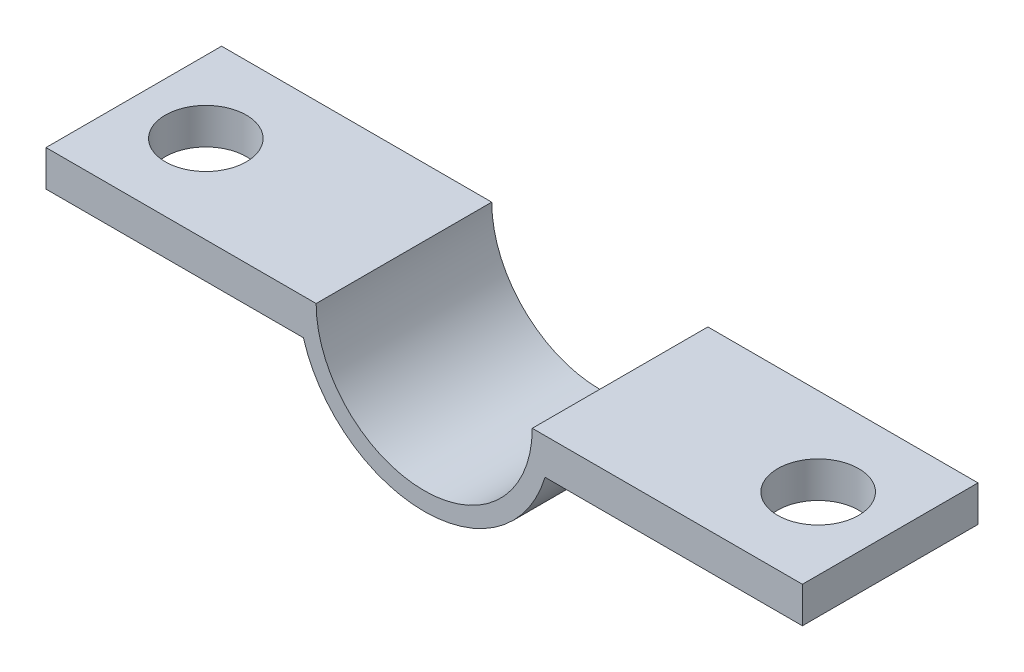
ISO-10303-21;
HEADER;
FILE_DESCRIPTION(('STEP AP214'),'2;1');
FILE_NAME('part.step','',(''),(''),'','','');
FILE_SCHEMA(('AUTOMOTIVE_DESIGN { 1 0 10303 214 1 1 1 1 }'));
ENDSEC;
DATA;
#1=APPLICATION_CONTEXT('core data for automotive mechanical design processes');
#2=APPLICATION_PROTOCOL_DEFINITION('international standard','automotive_design',2000,#1);
#3=PRODUCT_CONTEXT('',#1,'mechanical');
#4=PRODUCT('Part','Part','',(#3));
#5=PRODUCT_RELATED_PRODUCT_CATEGORY('part','',(#4));
#6=PRODUCT_DEFINITION_FORMATION('','',#4);
#7=PRODUCT_DEFINITION_CONTEXT('part definition',#1,'design');
#8=PRODUCT_DEFINITION('design','',#6,#7);
#9=PRODUCT_DEFINITION_SHAPE('','',#8);
#10=(LENGTH_UNIT() NAMED_UNIT(*) SI_UNIT(.MILLI.,.METRE.));
#11=(NAMED_UNIT(*) PLANE_ANGLE_UNIT() SI_UNIT($,.RADIAN.));
#12=(NAMED_UNIT(*) SI_UNIT($,.STERADIAN.) SOLID_ANGLE_UNIT());
#13=UNCERTAINTY_MEASURE_WITH_UNIT(LENGTH_MEASURE(1.E-05),#10,'distance_accuracy_value','');
#14=(GEOMETRIC_REPRESENTATION_CONTEXT(3) GLOBAL_UNCERTAINTY_ASSIGNED_CONTEXT((#13)) GLOBAL_UNIT_ASSIGNED_CONTEXT((#10,
#11,#12)) REPRESENTATION_CONTEXT('',''));
#15=CARTESIAN_POINT('',(0.,0.,0.));
#16=DIRECTION('',(0.,0.,1.));
#17=DIRECTION('',(1.,0.,0.));
#18=AXIS2_PLACEMENT_3D('',#15,#16,#17);
#19=CARTESIAN_POINT('',(0.,0.,9.75));
#20=DIRECTION('',(0.,0.,-1.));
#21=DIRECTION('',(-1.,0.,0.));
#22=AXIS2_PLACEMENT_3D('',#19,#20,#21);
#23=CYLINDRICAL_SURFACE('',#22,7.);
#24=CARTESIAN_POINT('',(0.,0.,0.));
#25=DIRECTION('',(0.,0.,1.));
#26=DIRECTION('',(1.,0.,0.));
#27=AXIS2_PLACEMENT_3D('',#24,#25,#26);
#28=CIRCLE('',#27,7.);
#29=CARTESIAN_POINT('',(-6.70820393249937,-2.,0.));
#30=VERTEX_POINT('',#29);
#31=CARTESIAN_POINT('',(6.70820393249937,-2.,0.));
#32=VERTEX_POINT('',#31);
#33=EDGE_CURVE('E123',#30,#32,#28,.T.);
#34=ORIENTED_EDGE('',*,*,#33,.T.);
#35=DIRECTION('',(0.,0.,-1.));
#36=VECTOR('',#35,1.);
#37=CARTESIAN_POINT('',(6.70820393249937,-2.,9.75));
#38=LINE('',#37,#36);
#39=CARTESIAN_POINT('',(6.70820393249937,-2.,9.75));
#40=VERTEX_POINT('',#39);
#41=EDGE_CURVE('E141',#32,#40,#38,.F.);
#42=ORIENTED_EDGE('',*,*,#41,.T.);
#43=CARTESIAN_POINT('',(0.,0.,9.75));
#44=DIRECTION('',(0.,0.,1.));
#45=DIRECTION('',(1.,0.,0.));
#46=AXIS2_PLACEMENT_3D('',#43,#44,#45);
#47=CIRCLE('',#46,7.);
#48=CARTESIAN_POINT('',(-6.70820393249937,-2.,9.75));
#49=VERTEX_POINT('',#48);
#50=EDGE_CURVE('E62',#49,#40,#47,.T.);
#51=ORIENTED_EDGE('',*,*,#50,.F.);
#52=DIRECTION('',(0.,0.,-1.));
#53=VECTOR('',#52,1.);
#54=CARTESIAN_POINT('',(-6.70820393249937,-2.,9.75));
#55=LINE('',#54,#53);
#56=EDGE_CURVE('E66',#30,#49,#55,.F.);
#57=ORIENTED_EDGE('',*,*,#56,.F.);
#58=EDGE_LOOP('',(#34,#42,#51,#57));
#59=FACE_BOUND('',#58,.T.);
#60=ADVANCED_FACE('F45',(#59),#23,.T.);
#61=CARTESIAN_POINT('',(6.,0.,9.75));
#62=DIRECTION('',(0.,1.,0.));
#63=DIRECTION('',(0.,0.,1.));
#64=AXIS2_PLACEMENT_3D('',#61,#62,#63);
#65=PLANE('',#64);
#66=CARTESIAN_POINT('',(17.,0.,4.875));
#67=DIRECTION('',(0.,1.,0.));
#68=DIRECTION('',(1.,0.,0.));
#69=AXIS2_PLACEMENT_3D('',#66,#67,#68);
#70=CIRCLE('',#69,2.25);
#71=CARTESIAN_POINT('',(19.25,0.,4.875));
#72=VERTEX_POINT('',#71);
#73=EDGE_CURVE('E210',#72,#72,#70,.T.);
#74=ORIENTED_EDGE('',*,*,#73,.F.);
#75=EDGE_LOOP('',(#74));
#76=FACE_BOUND('',#75,.T.);
#77=DIRECTION('',(1.,0.,0.));
#78=VECTOR('',#77,1.);
#79=CARTESIAN_POINT('',(6.,0.,0.));
#80=LINE('',#79,#78);
#81=CARTESIAN_POINT('',(6.,0.,0.));
#82=VERTEX_POINT('',#81);
#83=CARTESIAN_POINT('',(21.,0.,0.));
#84=VERTEX_POINT('',#83);
#85=EDGE_CURVE('E111',#82,#84,#80,.T.);
#86=ORIENTED_EDGE('',*,*,#85,.F.);
#87=DIRECTION('',(0.,0.,-1.));
#88=VECTOR('',#87,1.);
#89=CARTESIAN_POINT('',(6.,0.,9.75));
#90=LINE('',#89,#88);
#91=CARTESIAN_POINT('',(6.,0.,9.75));
#92=VERTEX_POINT('',#91);
#93=EDGE_CURVE('E11',#92,#82,#90,.T.);
#94=ORIENTED_EDGE('',*,*,#93,.F.);
#95=DIRECTION('',(1.,0.,0.));
#96=VECTOR('',#95,1.);
#97=CARTESIAN_POINT('',(6.,0.,9.75));
#98=LINE('',#97,#96);
#99=CARTESIAN_POINT('',(21.,0.,9.75));
#100=VERTEX_POINT('',#99);
#101=EDGE_CURVE('E138',#92,#100,#98,.T.);
#102=ORIENTED_EDGE('',*,*,#101,.T.);
#103=DIRECTION('',(0.,0.,-1.));
#104=VECTOR('',#103,1.);
#105=CARTESIAN_POINT('',(21.,0.,0.));
#106=LINE('',#105,#104);
#107=EDGE_CURVE('E130',#100,#84,#106,.T.);
#108=ORIENTED_EDGE('',*,*,#107,.T.);
#109=EDGE_LOOP('',(#86,#94,#102,#108));
#110=FACE_BOUND('',#109,.T.);
#111=ADVANCED_FACE('F136',(#76,#110),#65,.T.);
#112=CARTESIAN_POINT('',(0.,0.,9.75));
#113=DIRECTION('',(0.,0.,-1.));
#114=DIRECTION('',(-1.,0.,0.));
#115=AXIS2_PLACEMENT_3D('',#112,#113,#114);
#116=CYLINDRICAL_SURFACE('',#115,6.);
#117=CARTESIAN_POINT('',(0.,0.,0.));
#118=DIRECTION('',(0.,0.,1.));
#119=DIRECTION('',(1.,0.,0.));
#120=AXIS2_PLACEMENT_3D('',#117,#118,#119);
#121=CIRCLE('',#120,6.);
#122=CARTESIAN_POINT('',(-6.,0.,0.));
#123=VERTEX_POINT('',#122);
#124=EDGE_CURVE('E119',#123,#82,#121,.T.);
#125=ORIENTED_EDGE('',*,*,#124,.F.);
#126=DIRECTION('',(0.,0.,-1.));
#127=VECTOR('',#126,1.);
#128=CARTESIAN_POINT('',(-6.,0.,9.75));
#129=LINE('',#128,#127);
#130=CARTESIAN_POINT('',(-6.,0.,9.75));
#131=VERTEX_POINT('',#130);
#132=EDGE_CURVE('E54',#131,#123,#129,.T.);
#133=ORIENTED_EDGE('',*,*,#132,.F.);
#134=CARTESIAN_POINT('',(0.,0.,9.75));
#135=DIRECTION('',(0.,0.,1.));
#136=DIRECTION('',(1.,0.,0.));
#137=AXIS2_PLACEMENT_3D('',#134,#135,#136);
#138=CIRCLE('',#137,6.);
#139=EDGE_CURVE('E185',#131,#92,#138,.T.);
#140=ORIENTED_EDGE('',*,*,#139,.T.);
#141=ORIENTED_EDGE('',*,*,#93,.T.);
#142=EDGE_LOOP('',(#125,#133,#140,#141));
#143=FACE_BOUND('',#142,.T.);
#144=ADVANCED_FACE('F235',(#143),#116,.F.);
#145=CARTESIAN_POINT('',(-7.,0.,9.75));
#146=DIRECTION('',(0.,1.,0.));
#147=DIRECTION('',(-1.,0.,0.));
#148=AXIS2_PLACEMENT_3D('',#145,#146,#147);
#149=PLANE('',#148);
#150=CARTESIAN_POINT('',(-17.,0.,4.875));
#151=DIRECTION('',(0.,1.,0.));
#152=DIRECTION('',(-1.,0.,0.));
#153=AXIS2_PLACEMENT_3D('',#150,#151,#152);
#154=CIRCLE('',#153,2.25);
#155=CARTESIAN_POINT('',(-19.25,0.,4.875));
#156=VERTEX_POINT('',#155);
#157=EDGE_CURVE('E203',#156,#156,#154,.T.);
#158=ORIENTED_EDGE('',*,*,#157,.F.);
#159=EDGE_LOOP('',(#158));
#160=FACE_BOUND('',#159,.T.);
#161=DIRECTION('',(1.,0.,0.));
#162=VECTOR('',#161,1.);
#163=CARTESIAN_POINT('',(-7.,0.,0.));
#164=LINE('',#163,#162);
#165=CARTESIAN_POINT('',(-21.,0.,0.));
#166=VERTEX_POINT('',#165);
#167=EDGE_CURVE('E182',#166,#123,#164,.T.);
#168=ORIENTED_EDGE('',*,*,#167,.F.);
#169=DIRECTION('',(0.,0.,1.));
#170=VECTOR('',#169,1.);
#171=CARTESIAN_POINT('',(-21.,0.,0.));
#172=LINE('',#171,#170);
#173=CARTESIAN_POINT('',(-21.,0.,9.75));
#174=VERTEX_POINT('',#173);
#175=EDGE_CURVE('E146',#166,#174,#172,.T.);
#176=ORIENTED_EDGE('',*,*,#175,.T.);
#177=DIRECTION('',(1.,0.,0.));
#178=VECTOR('',#177,1.);
#179=CARTESIAN_POINT('',(-7.,0.,9.75));
#180=LINE('',#179,#178);
#181=EDGE_CURVE('E189',#174,#131,#180,.T.);
#182=ORIENTED_EDGE('',*,*,#181,.T.);
#183=ORIENTED_EDGE('',*,*,#132,.T.);
#184=EDGE_LOOP('',(#168,#176,#182,#183));
#185=FACE_BOUND('',#184,.T.);
#186=ADVANCED_FACE('F233',(#160,#185),#149,.T.);
#187=CARTESIAN_POINT('',(0.,0.,9.75));
#188=DIRECTION('',(0.,0.,1.));
#189=DIRECTION('',(1.,0.,0.));
#190=AXIS2_PLACEMENT_3D('',#187,#188,#189);
#191=PLANE('',#190);
#192=ORIENTED_EDGE('',*,*,#101,.F.);
#193=ORIENTED_EDGE('',*,*,#139,.F.);
#194=ORIENTED_EDGE('',*,*,#181,.F.);
#195=DIRECTION('',(0.,1.,0.));
#196=VECTOR('',#195,1.);
#197=CARTESIAN_POINT('',(-21.,-2.,9.75));
#198=LINE('',#197,#196);
#199=CARTESIAN_POINT('',(-21.,-2.,9.75));
#200=VERTEX_POINT('',#199);
#201=EDGE_CURVE('E167',#200,#174,#198,.T.);
#202=ORIENTED_EDGE('',*,*,#201,.F.);
#203=DIRECTION('',(1.,0.,0.));
#204=VECTOR('',#203,1.);
#205=CARTESIAN_POINT('',(-21.,-2.,9.75));
#206=LINE('',#205,#204);
#207=EDGE_CURVE('E160',#200,#49,#206,.T.);
#208=ORIENTED_EDGE('',*,*,#207,.T.);
#209=ORIENTED_EDGE('',*,*,#50,.T.);
#210=DIRECTION('',(1.,0.,0.));
#211=VECTOR('',#210,1.);
#212=CARTESIAN_POINT('',(6.,-2.,9.75));
#213=LINE('',#212,#211);
#214=CARTESIAN_POINT('',(21.,-2.,9.75));
#215=VERTEX_POINT('',#214);
#216=EDGE_CURVE('E142',#40,#215,#213,.T.);
#217=ORIENTED_EDGE('',*,*,#216,.T.);
#218=DIRECTION('',(0.,1.,0.));
#219=VECTOR('',#218,1.);
#220=CARTESIAN_POINT('',(21.,-2.,9.75));
#221=LINE('',#220,#219);
#222=EDGE_CURVE('E134',#215,#100,#221,.T.);
#223=ORIENTED_EDGE('',*,*,#222,.T.);
#224=EDGE_LOOP('',(#192,#193,#194,#202,#208,#209,#217,#223));
#225=FACE_BOUND('',#224,.T.);
#226=ADVANCED_FACE('F219',(#225),#191,.T.);
#227=CARTESIAN_POINT('',(0.,0.,0.));
#228=DIRECTION('',(0.,0.,1.));
#229=DIRECTION('',(1.,0.,0.));
#230=AXIS2_PLACEMENT_3D('',#227,#228,#229);
#231=PLANE('',#230);
#232=ORIENTED_EDGE('',*,*,#124,.T.);
#233=ORIENTED_EDGE('',*,*,#85,.T.);
#234=DIRECTION('',(0.,1.,0.));
#235=VECTOR('',#234,1.);
#236=CARTESIAN_POINT('',(21.,-2.,0.));
#237=LINE('',#236,#235);
#238=CARTESIAN_POINT('',(21.,-2.,0.));
#239=VERTEX_POINT('',#238);
#240=EDGE_CURVE('E115',#239,#84,#237,.T.);
#241=ORIENTED_EDGE('',*,*,#240,.F.);
#242=DIRECTION('',(-1.,0.,0.));
#243=VECTOR('',#242,1.);
#244=CARTESIAN_POINT('',(6.,-2.,0.));
#245=LINE('',#244,#243);
#246=EDGE_CURVE('E151',#239,#32,#245,.T.);
#247=ORIENTED_EDGE('',*,*,#246,.T.);
#248=ORIENTED_EDGE('',*,*,#33,.F.);
#249=DIRECTION('',(-1.,0.,0.));
#250=VECTOR('',#249,1.);
#251=CARTESIAN_POINT('',(-21.,-2.,0.));
#252=LINE('',#251,#250);
#253=CARTESIAN_POINT('',(-21.,-2.,0.));
#254=VERTEX_POINT('',#253);
#255=EDGE_CURVE('E164',#30,#254,#252,.T.);
#256=ORIENTED_EDGE('',*,*,#255,.T.);
#257=DIRECTION('',(0.,1.,0.));
#258=VECTOR('',#257,1.);
#259=CARTESIAN_POINT('',(-21.,-2.,0.));
#260=LINE('',#259,#258);
#261=EDGE_CURVE('E171',#254,#166,#260,.T.);
#262=ORIENTED_EDGE('',*,*,#261,.T.);
#263=ORIENTED_EDGE('',*,*,#167,.T.);
#264=EDGE_LOOP('',(#232,#233,#241,#247,#248,#256,#262,#263));
#265=FACE_BOUND('',#264,.T.);
#266=ADVANCED_FACE('F113',(#265),#231,.F.);
#267=CARTESIAN_POINT('',(0.,-2.,0.));
#268=DIRECTION('',(0.,1.,0.));
#269=DIRECTION('',(-1.,0.,0.));
#270=AXIS2_PLACEMENT_3D('',#267,#268,#269);
#271=PLANE('',#270);
#272=CARTESIAN_POINT('',(-17.,-2.,4.875));
#273=DIRECTION('',(0.,1.,0.));
#274=DIRECTION('',(-1.,0.,0.));
#275=AXIS2_PLACEMENT_3D('',#272,#273,#274);
#276=CIRCLE('',#275,2.25);
#277=CARTESIAN_POINT('',(-19.25,-2.,4.875));
#278=VERTEX_POINT('',#277);
#279=EDGE_CURVE('E48',#278,#278,#276,.T.);
#280=ORIENTED_EDGE('',*,*,#279,.T.);
#281=EDGE_LOOP('',(#280));
#282=FACE_BOUND('',#281,.T.);
#283=ORIENTED_EDGE('',*,*,#255,.F.);
#284=ORIENTED_EDGE('',*,*,#56,.T.);
#285=ORIENTED_EDGE('',*,*,#207,.F.);
#286=DIRECTION('',(0.,0.,1.));
#287=VECTOR('',#286,1.);
#288=CARTESIAN_POINT('',(-21.,-2.,0.));
#289=LINE('',#288,#287);
#290=EDGE_CURVE('E156',#254,#200,#289,.T.);
#291=ORIENTED_EDGE('',*,*,#290,.F.);
#292=EDGE_LOOP('',(#283,#284,#285,#291));
#293=FACE_BOUND('',#292,.T.);
#294=ADVANCED_FACE('F227',(#282,#293),#271,.F.);
#295=CARTESIAN_POINT('',(-21.,-2.,0.));
#296=DIRECTION('',(-1.,0.,0.));
#297=DIRECTION('',(0.,-1.,0.));
#298=AXIS2_PLACEMENT_3D('',#295,#296,#297);
#299=PLANE('',#298);
#300=ORIENTED_EDGE('',*,*,#175,.F.);
#301=ORIENTED_EDGE('',*,*,#261,.F.);
#302=ORIENTED_EDGE('',*,*,#290,.T.);
#303=ORIENTED_EDGE('',*,*,#201,.T.);
#304=EDGE_LOOP('',(#300,#301,#302,#303));
#305=FACE_BOUND('',#304,.T.);
#306=ADVANCED_FACE('F231',(#305),#299,.T.);
#307=CARTESIAN_POINT('',(0.,-2.,0.));
#308=DIRECTION('',(0.,-1.,0.));
#309=DIRECTION('',(1.,0.,0.));
#310=AXIS2_PLACEMENT_3D('',#307,#308,#309);
#311=PLANE('',#310);
#312=CARTESIAN_POINT('',(17.,-2.,4.875));
#313=DIRECTION('',(0.,-1.,0.));
#314=DIRECTION('',(1.,0.,0.));
#315=AXIS2_PLACEMENT_3D('',#312,#313,#314);
#316=CIRCLE('',#315,2.25);
#317=CARTESIAN_POINT('',(19.25,-2.,4.875));
#318=VERTEX_POINT('',#317);
#319=EDGE_CURVE('E200',#318,#318,#316,.T.);
#320=ORIENTED_EDGE('',*,*,#319,.F.);
#321=EDGE_LOOP('',(#320));
#322=FACE_BOUND('',#321,.T.);
#323=ORIENTED_EDGE('',*,*,#41,.F.);
#324=ORIENTED_EDGE('',*,*,#246,.F.);
#325=DIRECTION('',(0.,0.,-1.));
#326=VECTOR('',#325,1.);
#327=CARTESIAN_POINT('',(21.,-2.,0.));
#328=LINE('',#327,#326);
#329=EDGE_CURVE('E132',#215,#239,#328,.T.);
#330=ORIENTED_EDGE('',*,*,#329,.F.);
#331=ORIENTED_EDGE('',*,*,#216,.F.);
#332=EDGE_LOOP('',(#323,#324,#330,#331));
#333=FACE_BOUND('',#332,.T.);
#334=ADVANCED_FACE('F222',(#322,#333),#311,.T.);
#335=CARTESIAN_POINT('',(21.,-2.,0.));
#336=DIRECTION('',(1.,0.,0.));
#337=DIRECTION('',(0.,1.,0.));
#338=AXIS2_PLACEMENT_3D('',#335,#336,#337);
#339=PLANE('',#338);
#340=ORIENTED_EDGE('',*,*,#107,.F.);
#341=ORIENTED_EDGE('',*,*,#222,.F.);
#342=ORIENTED_EDGE('',*,*,#329,.T.);
#343=ORIENTED_EDGE('',*,*,#240,.T.);
#344=EDGE_LOOP('',(#340,#341,#342,#343));
#345=FACE_BOUND('',#344,.T.);
#346=ADVANCED_FACE('F128',(#345),#339,.T.);
#347=CARTESIAN_POINT('',(17.,-7.,4.875));
#348=DIRECTION('',(0.,1.,0.));
#349=DIRECTION('',(-1.,0.,0.));
#350=AXIS2_PLACEMENT_3D('',#347,#348,#349);
#351=CYLINDRICAL_SURFACE('',#350,2.25);
#352=ORIENTED_EDGE('',*,*,#319,.T.);
#353=EDGE_LOOP('',(#352));
#354=FACE_BOUND('',#353,.T.);
#355=ORIENTED_EDGE('',*,*,#73,.T.);
#356=EDGE_LOOP('',(#355));
#357=FACE_BOUND('',#356,.T.);
#358=ADVANCED_FACE('F278',(#354,#357),#351,.F.);
#359=CARTESIAN_POINT('',(-17.,-7.,4.875));
#360=DIRECTION('',(0.,1.,0.));
#361=DIRECTION('',(-1.,0.,0.));
#362=AXIS2_PLACEMENT_3D('',#359,#360,#361);
#363=CYLINDRICAL_SURFACE('',#362,2.25);
#364=ORIENTED_EDGE('',*,*,#157,.T.);
#365=EDGE_LOOP('',(#364));
#366=FACE_BOUND('',#365,.T.);
#367=ORIENTED_EDGE('',*,*,#279,.F.);
#368=EDGE_LOOP('',(#367));
#369=FACE_BOUND('',#368,.T.);
#370=ADVANCED_FACE('F310',(#366,#369),#363,.F.);
#371=CLOSED_SHELL('',(#60,#111,#144,#186,#226,#266,#294,#306,#334,#346,#358,#370));
#372=MANIFOLD_SOLID_BREP('B2',#371);
#373=ADVANCED_BREP_SHAPE_REPRESENTATION('',(#18,#372),#14);
#374=SHAPE_DEFINITION_REPRESENTATION(#9,#373);
ENDSEC;
END-ISO-10303-21;
